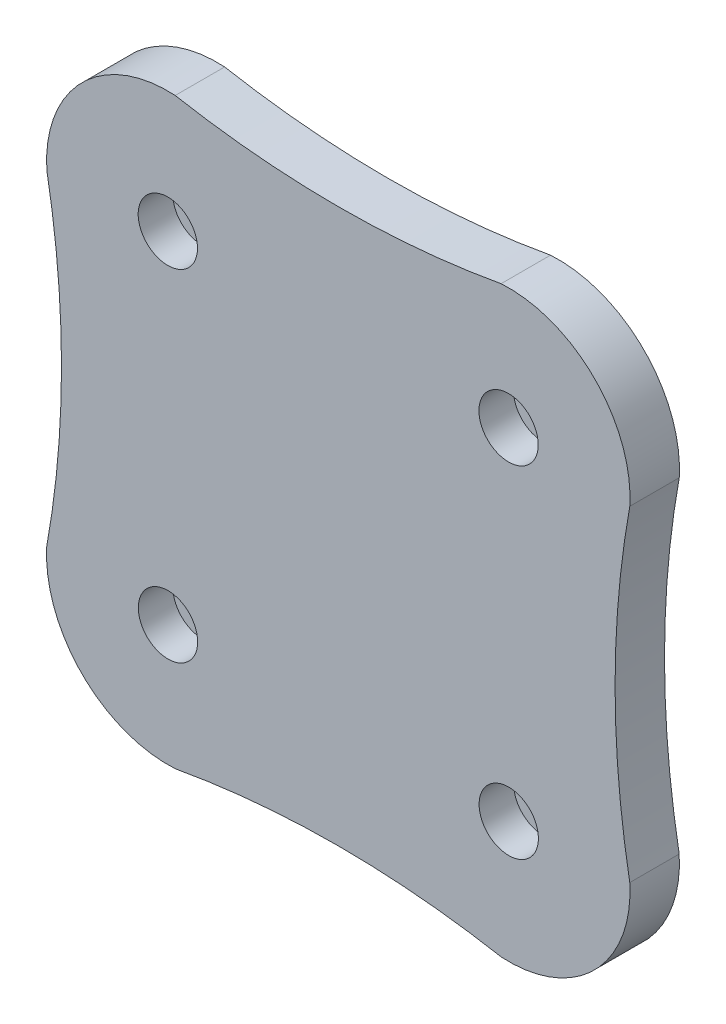
ISO-10303-21;
HEADER;
FILE_DESCRIPTION(('STEP AP214'),'2;1');
FILE_NAME('part.step','',(''),(''),'','','');
FILE_SCHEMA(('AUTOMOTIVE_DESIGN { 1 0 10303 214 1 1 1 1 }'));
ENDSEC;
DATA;
#1=APPLICATION_CONTEXT('core data for automotive mechanical design processes');
#2=APPLICATION_PROTOCOL_DEFINITION('international standard','automotive_design',2000,#1);
#3=PRODUCT_CONTEXT('',#1,'mechanical');
#4=PRODUCT('Part','Part','',(#3));
#5=PRODUCT_RELATED_PRODUCT_CATEGORY('part','',(#4));
#6=PRODUCT_DEFINITION_FORMATION('','',#4);
#7=PRODUCT_DEFINITION_CONTEXT('part definition',#1,'design');
#8=PRODUCT_DEFINITION('design','',#6,#7);
#9=PRODUCT_DEFINITION_SHAPE('','',#8);
#10=(LENGTH_UNIT() NAMED_UNIT(*) SI_UNIT(.MILLI.,.METRE.));
#11=(NAMED_UNIT(*) PLANE_ANGLE_UNIT() SI_UNIT($,.RADIAN.));
#12=(NAMED_UNIT(*) SI_UNIT($,.STERADIAN.) SOLID_ANGLE_UNIT());
#13=UNCERTAINTY_MEASURE_WITH_UNIT(LENGTH_MEASURE(1.E-05),#10,'distance_accuracy_value','');
#14=(GEOMETRIC_REPRESENTATION_CONTEXT(3) GLOBAL_UNCERTAINTY_ASSIGNED_CONTEXT((#13)) GLOBAL_UNIT_ASSIGNED_CONTEXT((#10,
#11,#12)) REPRESENTATION_CONTEXT('',''));
#15=CARTESIAN_POINT('',(0.,0.,0.));
#16=DIRECTION('',(0.,0.,1.));
#17=DIRECTION('',(1.,0.,0.));
#18=AXIS2_PLACEMENT_3D('',#15,#16,#17);
#19=CARTESIAN_POINT('',(57.2260711619407,-46.7757819921621,5.));
#20=DIRECTION('',(0.,0.,-1.));
#21=DIRECTION('',(-1.,0.,0.));
#22=AXIS2_PLACEMENT_3D('',#19,#20,#21);
#23=CYLINDRICAL_SURFACE('',#22,1.5);
#24=CARTESIAN_POINT('',(57.2260711619407,-46.7757819921621,0.));
#25=DIRECTION('',(0.,0.,1.));
#26=DIRECTION('',(1.,0.,0.));
#27=AXIS2_PLACEMENT_3D('',#24,#25,#26);
#28=CIRCLE('',#27,1.5);
#29=CARTESIAN_POINT('',(58.7260711619407,-46.7757819921621,0.));
#30=VERTEX_POINT('',#29);
#31=EDGE_CURVE('E158',#30,#30,#28,.T.);
#32=ORIENTED_EDGE('',*,*,#31,.F.);
#33=EDGE_LOOP('',(#32));
#34=FACE_BOUND('',#33,.T.);
#35=CARTESIAN_POINT('',(57.2260711619407,-46.7757819921621,1.5));
#36=DIRECTION('',(0.,0.,1.));
#37=DIRECTION('',(1.,0.,0.));
#38=AXIS2_PLACEMENT_3D('',#35,#36,#37);
#39=CIRCLE('',#38,1.5);
#40=CARTESIAN_POINT('',(58.7260711619407,-46.7757819921621,1.5));
#41=VERTEX_POINT('',#40);
#42=EDGE_CURVE('E39',#41,#41,#39,.T.);
#43=ORIENTED_EDGE('',*,*,#42,.T.);
#44=EDGE_LOOP('',(#43));
#45=FACE_BOUND('',#44,.T.);
#46=ADVANCED_FACE('F35',(#34,#45),#23,.F.);
#47=CARTESIAN_POINT('',(57.2442181625764,-81.24607131673,5.));
#48=DIRECTION('',(0.,0.,-1.));
#49=DIRECTION('',(-1.,0.,0.));
#50=AXIS2_PLACEMENT_3D('',#47,#48,#49);
#51=CYLINDRICAL_SURFACE('',#50,1.5);
#52=CARTESIAN_POINT('',(57.2442181625764,-81.24607131673,0.));
#53=DIRECTION('',(0.,0.,1.));
#54=DIRECTION('',(1.,0.,0.));
#55=AXIS2_PLACEMENT_3D('',#52,#53,#54);
#56=CIRCLE('',#55,1.5);
#57=CARTESIAN_POINT('',(58.7442181625764,-81.24607131673,0.));
#58=VERTEX_POINT('',#57);
#59=EDGE_CURVE('E155',#58,#58,#56,.T.);
#60=ORIENTED_EDGE('',*,*,#59,.F.);
#61=EDGE_LOOP('',(#60));
#62=FACE_BOUND('',#61,.T.);
#63=CARTESIAN_POINT('',(57.2442181625764,-81.24607131673,1.5));
#64=DIRECTION('',(0.,0.,1.));
#65=DIRECTION('',(1.,0.,0.));
#66=AXIS2_PLACEMENT_3D('',#63,#64,#65);
#67=CIRCLE('',#66,1.5);
#68=CARTESIAN_POINT('',(58.7442181625764,-81.24607131673,1.5));
#69=VERTEX_POINT('',#68);
#70=EDGE_CURVE('E178',#69,#69,#67,.T.);
#71=ORIENTED_EDGE('',*,*,#70,.T.);
#72=EDGE_LOOP('',(#71));
#73=FACE_BOUND('',#72,.T.);
#74=ADVANCED_FACE('F231',(#62,#73),#51,.F.);
#75=CARTESIAN_POINT('',(22.7739288380084,-81.2642183173656,5.));
#76=DIRECTION('',(0.,0.,-1.));
#77=DIRECTION('',(-1.,0.,0.));
#78=AXIS2_PLACEMENT_3D('',#75,#76,#77);
#79=CYLINDRICAL_SURFACE('',#78,1.5);
#80=CARTESIAN_POINT('',(22.7739288380084,-81.2642183173656,0.));
#81=DIRECTION('',(0.,0.,1.));
#82=DIRECTION('',(1.,0.,0.));
#83=AXIS2_PLACEMENT_3D('',#80,#81,#82);
#84=CIRCLE('',#83,1.5);
#85=CARTESIAN_POINT('',(24.2739288380084,-81.2642183173656,0.));
#86=VERTEX_POINT('',#85);
#87=EDGE_CURVE('E152',#86,#86,#84,.T.);
#88=ORIENTED_EDGE('',*,*,#87,.F.);
#89=EDGE_LOOP('',(#88));
#90=FACE_BOUND('',#89,.T.);
#91=CARTESIAN_POINT('',(22.7739288380084,-81.2642183173656,1.5));
#92=DIRECTION('',(0.,0.,1.));
#93=DIRECTION('',(1.,0.,0.));
#94=AXIS2_PLACEMENT_3D('',#91,#92,#93);
#95=CIRCLE('',#94,1.5);
#96=CARTESIAN_POINT('',(24.2739288380084,-81.2642183173656,1.5));
#97=VERTEX_POINT('',#96);
#98=EDGE_CURVE('E176',#97,#97,#95,.T.);
#99=ORIENTED_EDGE('',*,*,#98,.T.);
#100=EDGE_LOOP('',(#99));
#101=FACE_BOUND('',#100,.T.);
#102=ADVANCED_FACE('F237',(#90,#101),#79,.F.);
#103=CARTESIAN_POINT('',(22.7557818373727,-46.7939289927979,5.));
#104=DIRECTION('',(0.,0.,-1.));
#105=DIRECTION('',(-1.,0.,0.));
#106=AXIS2_PLACEMENT_3D('',#103,#104,#105);
#107=CYLINDRICAL_SURFACE('',#106,1.5);
#108=CARTESIAN_POINT('',(22.7557818373727,-46.7939289927979,0.));
#109=DIRECTION('',(0.,0.,1.));
#110=DIRECTION('',(1.,0.,0.));
#111=AXIS2_PLACEMENT_3D('',#108,#109,#110);
#112=CIRCLE('',#111,1.5);
#113=CARTESIAN_POINT('',(24.2557818373727,-46.7939289927979,0.));
#114=VERTEX_POINT('',#113);
#115=EDGE_CURVE('E161',#114,#114,#112,.T.);
#116=ORIENTED_EDGE('',*,*,#115,.F.);
#117=EDGE_LOOP('',(#116));
#118=FACE_BOUND('',#117,.T.);
#119=CARTESIAN_POINT('',(22.7557818373727,-46.7939289927979,1.5));
#120=DIRECTION('',(0.,0.,1.));
#121=DIRECTION('',(1.,0.,0.));
#122=AXIS2_PLACEMENT_3D('',#119,#120,#121);
#123=CIRCLE('',#122,1.5);
#124=CARTESIAN_POINT('',(24.2557818373727,-46.7939289927979,1.5));
#125=VERTEX_POINT('',#124);
#126=EDGE_CURVE('E135',#125,#125,#123,.T.);
#127=ORIENTED_EDGE('',*,*,#126,.T.);
#128=EDGE_LOOP('',(#127));
#129=FACE_BOUND('',#128,.T.);
#130=ADVANCED_FACE('F242',(#118,#129),#107,.F.);
#131=CARTESIAN_POINT('',(39.9999999999743,55.9799998452358,5.));
#132=DIRECTION('',(0.,0.,-1.));
#133=DIRECTION('',(-1.,0.,0.));
#134=AXIS2_PLACEMENT_3D('',#131,#132,#133);
#135=CYLINDRICAL_SURFACE('',#134,92.0000000000001);
#136=CARTESIAN_POINT('',(39.9999999999743,55.9799998452358,0.));
#137=DIRECTION('',(0.,0.,1.));
#138=DIRECTION('',(1.,0.,0.));
#139=AXIS2_PLACEMENT_3D('',#136,#137,#138);
#140=CIRCLE('',#139,92.0000000000001);
#141=CARTESIAN_POINT('',(23.5019244533808,-34.5286378821044,0.));
#142=VERTEX_POINT('',#141);
#143=CARTESIAN_POINT('',(56.4698938359388,-34.5337703614685,0.));
#144=VERTEX_POINT('',#143);
#145=EDGE_CURVE('E131',#142,#144,#140,.T.);
#146=ORIENTED_EDGE('',*,*,#145,.F.);
#147=DIRECTION('',(0.,0.,-1.));
#148=VECTOR('',#147,1.);
#149=CARTESIAN_POINT('',(23.5019244533808,-34.5286378821044,5.));
#150=LINE('',#149,#148);
#151=CARTESIAN_POINT('',(23.5019244533808,-34.5286378821044,5.));
#152=VERTEX_POINT('',#151);
#153=EDGE_CURVE('E11',#152,#142,#150,.T.);
#154=ORIENTED_EDGE('',*,*,#153,.F.);
#155=CARTESIAN_POINT('',(39.9999999999743,55.9799998452358,5.));
#156=DIRECTION('',(0.,0.,1.));
#157=DIRECTION('',(1.,0.,0.));
#158=AXIS2_PLACEMENT_3D('',#155,#156,#157);
#159=CIRCLE('',#158,92.0000000000001);
#160=CARTESIAN_POINT('',(56.4698938359388,-34.5337703614685,5.));
#161=VERTEX_POINT('',#160);
#162=EDGE_CURVE('E164',#152,#161,#159,.T.);
#163=ORIENTED_EDGE('',*,*,#162,.T.);
#164=DIRECTION('',(0.,0.,-1.));
#165=VECTOR('',#164,1.);
#166=CARTESIAN_POINT('',(56.4698938359388,-34.5337703614685,5.));
#167=LINE('',#166,#165);
#168=EDGE_CURVE('E88',#161,#144,#167,.T.);
#169=ORIENTED_EDGE('',*,*,#168,.T.);
#170=EDGE_LOOP('',(#146,#154,#163,#169));
#171=FACE_BOUND('',#170,.T.);
#172=ADVANCED_FACE('F37',(#171),#135,.F.);
#173=CARTESIAN_POINT('',(22.766459460917,-46.7832513692541,5.));
#174=DIRECTION('',(0.,0.,-1.));
#175=DIRECTION('',(-1.,0.,0.));
#176=AXIS2_PLACEMENT_3D('',#173,#174,#175);
#177=CYLINDRICAL_SURFACE('',#176,12.2766632467691);
#178=CARTESIAN_POINT('',(22.766459460917,-46.7832513692541,0.));
#179=DIRECTION('',(0.,0.,1.));
#180=DIRECTION('',(1.,0.,0.));
#181=AXIS2_PLACEMENT_3D('',#178,#179,#180);
#182=CIRCLE('',#181,12.2766632467691);
#183=CARTESIAN_POINT('',(10.5137702066786,-47.5501063187987,0.));
#184=VERTEX_POINT('',#183);
#185=EDGE_CURVE('E134',#142,#184,#182,.T.);
#186=ORIENTED_EDGE('',*,*,#185,.T.);
#187=DIRECTION('',(0.,0.,-1.));
#188=VECTOR('',#187,1.);
#189=CARTESIAN_POINT('',(10.5137702066786,-47.5501063187987,5.));
#190=LINE('',#189,#188);
#191=CARTESIAN_POINT('',(10.5137702066786,-47.5501063187987,5.));
#192=VERTEX_POINT('',#191);
#193=EDGE_CURVE('E45',#192,#184,#190,.T.);
#194=ORIENTED_EDGE('',*,*,#193,.F.);
#195=CARTESIAN_POINT('',(22.766459460917,-46.7832513692541,5.));
#196=DIRECTION('',(0.,0.,1.));
#197=DIRECTION('',(1.,0.,0.));
#198=AXIS2_PLACEMENT_3D('',#195,#196,#197);
#199=CIRCLE('',#198,12.2766632467691);
#200=EDGE_CURVE('E196',#152,#192,#199,.T.);
#201=ORIENTED_EDGE('',*,*,#200,.F.);
#202=ORIENTED_EDGE('',*,*,#153,.T.);
#203=EDGE_LOOP('',(#186,#194,#201,#202));
#204=FACE_BOUND('',#203,.T.);
#205=ADVANCED_FACE('F215',(#204),#177,.T.);
#206=CARTESIAN_POINT('',(-80.0000000000232,-64.0200001547639,5.));
#207=DIRECTION('',(0.,0.,-1.));
#208=DIRECTION('',(-1.,0.,0.));
#209=AXIS2_PLACEMENT_3D('',#206,#207,#208);
#210=CYLINDRICAL_SURFACE('',#209,91.9999999999977);
#211=CARTESIAN_POINT('',(-80.0000000000232,-64.0200001547639,0.));
#212=DIRECTION('',(0.,0.,1.));
#213=DIRECTION('',(1.,0.,0.));
#214=AXIS2_PLACEMENT_3D('',#211,#212,#213);
#215=CIRCLE('',#214,91.9999999999977);
#216=CARTESIAN_POINT('',(10.5086377273147,-80.518075701357,0.));
#217=VERTEX_POINT('',#216);
#218=EDGE_CURVE('E138',#217,#184,#215,.T.);
#219=ORIENTED_EDGE('',*,*,#218,.F.);
#220=DIRECTION('',(0.,0.,-1.));
#221=VECTOR('',#220,1.);
#222=CARTESIAN_POINT('',(10.5086377273147,-80.518075701357,5.));
#223=LINE('',#222,#221);
#224=CARTESIAN_POINT('',(10.5086377273147,-80.518075701357,5.));
#225=VERTEX_POINT('',#224);
#226=EDGE_CURVE('E170',#225,#217,#223,.T.);
#227=ORIENTED_EDGE('',*,*,#226,.F.);
#228=CARTESIAN_POINT('',(-80.0000000000232,-64.0200001547639,5.));
#229=DIRECTION('',(0.,0.,1.));
#230=DIRECTION('',(1.,0.,0.));
#231=AXIS2_PLACEMENT_3D('',#228,#229,#230);
#232=CIRCLE('',#231,91.9999999999977);
#233=EDGE_CURVE('E198',#225,#192,#232,.T.);
#234=ORIENTED_EDGE('',*,*,#233,.T.);
#235=ORIENTED_EDGE('',*,*,#193,.T.);
#236=EDGE_LOOP('',(#219,#227,#234,#235));
#237=FACE_BOUND('',#236,.T.);
#238=ADVANCED_FACE('F218',(#237),#210,.F.);
#239=CARTESIAN_POINT('',(22.7632512144644,-81.2535406938215,5.));
#240=DIRECTION('',(0.,0.,-1.));
#241=DIRECTION('',(-1.,0.,0.));
#242=AXIS2_PLACEMENT_3D('',#239,#240,#241);
#243=CYLINDRICAL_SURFACE('',#242,12.2766632467691);
#244=CARTESIAN_POINT('',(22.7632512144644,-81.2535406938215,0.));
#245=DIRECTION('',(0.,0.,1.));
#246=DIRECTION('',(1.,0.,0.));
#247=AXIS2_PLACEMENT_3D('',#244,#245,#246);
#248=CIRCLE('',#247,12.2766632467691);
#249=CARTESIAN_POINT('',(23.5301061640101,-93.5062299480599,0.));
#250=VERTEX_POINT('',#249);
#251=EDGE_CURVE('E141',#217,#250,#248,.T.);
#252=ORIENTED_EDGE('',*,*,#251,.T.);
#253=DIRECTION('',(0.,0.,-1.));
#254=VECTOR('',#253,1.);
#255=CARTESIAN_POINT('',(23.5301061640101,-93.5062299480599,5.));
#256=LINE('',#255,#254);
#257=CARTESIAN_POINT('',(23.5301061640101,-93.5062299480599,5.));
#258=VERTEX_POINT('',#257);
#259=EDGE_CURVE('E168',#258,#250,#256,.T.);
#260=ORIENTED_EDGE('',*,*,#259,.F.);
#261=CARTESIAN_POINT('',(22.7632512144644,-81.2535406938215,5.));
#262=DIRECTION('',(0.,0.,1.));
#263=DIRECTION('',(1.,0.,0.));
#264=AXIS2_PLACEMENT_3D('',#261,#262,#263);
#265=CIRCLE('',#264,12.2766632467691);
#266=EDGE_CURVE('E201',#225,#258,#265,.T.);
#267=ORIENTED_EDGE('',*,*,#266,.F.);
#268=ORIENTED_EDGE('',*,*,#226,.T.);
#269=EDGE_LOOP('',(#252,#260,#267,#268));
#270=FACE_BOUND('',#269,.T.);
#271=ADVANCED_FACE('F221',(#270),#243,.T.);
#272=CARTESIAN_POINT('',(39.9999999999744,-184.020000154764,5.));
#273=DIRECTION('',(0.,0.,-1.));
#274=DIRECTION('',(-1.,0.,0.));
#275=AXIS2_PLACEMENT_3D('',#272,#273,#274);
#276=CYLINDRICAL_SURFACE('',#275,92.);
#277=CARTESIAN_POINT('',(39.9999999999744,-184.020000154764,0.));
#278=DIRECTION('',(0.,0.,1.));
#279=DIRECTION('',(1.,0.,0.));
#280=AXIS2_PLACEMENT_3D('',#277,#278,#279);
#281=CIRCLE('',#280,92.);
#282=CARTESIAN_POINT('',(56.4980755465676,-93.511362427424,0.));
#283=VERTEX_POINT('',#282);
#284=EDGE_CURVE('E144',#283,#250,#281,.T.);
#285=ORIENTED_EDGE('',*,*,#284,.F.);
#286=DIRECTION('',(0.,0.,-1.));
#287=VECTOR('',#286,1.);
#288=CARTESIAN_POINT('',(56.4980755465676,-93.511362427424,5.));
#289=LINE('',#288,#287);
#290=CARTESIAN_POINT('',(56.4980755465676,-93.511362427424,5.));
#291=VERTEX_POINT('',#290);
#292=EDGE_CURVE('E124',#291,#283,#289,.T.);
#293=ORIENTED_EDGE('',*,*,#292,.F.);
#294=CARTESIAN_POINT('',(39.9999999999744,-184.020000154764,5.));
#295=DIRECTION('',(0.,0.,1.));
#296=DIRECTION('',(1.,0.,0.));
#297=AXIS2_PLACEMENT_3D('',#294,#295,#296);
#298=CIRCLE('',#297,92.);
#299=EDGE_CURVE('E113',#291,#258,#298,.T.);
#300=ORIENTED_EDGE('',*,*,#299,.T.);
#301=ORIENTED_EDGE('',*,*,#259,.T.);
#302=EDGE_LOOP('',(#285,#293,#300,#301));
#303=FACE_BOUND('',#302,.T.);
#304=ADVANCED_FACE('F204',(#303),#276,.F.);
#305=CARTESIAN_POINT('',(57.2335405390316,-81.2567489402743,5.));
#306=DIRECTION('',(0.,0.,-1.));
#307=DIRECTION('',(-1.,0.,0.));
#308=AXIS2_PLACEMENT_3D('',#305,#306,#307);
#309=CYLINDRICAL_SURFACE('',#308,12.2766632467691);
#310=CARTESIAN_POINT('',(57.2335405390316,-81.2567489402743,0.));
#311=DIRECTION('',(0.,0.,1.));
#312=DIRECTION('',(1.,0.,0.));
#313=AXIS2_PLACEMENT_3D('',#310,#311,#312);
#314=CIRCLE('',#313,12.2766632467691);
#315=CARTESIAN_POINT('',(69.48622979327,-80.48989399073,0.));
#316=VERTEX_POINT('',#315);
#317=EDGE_CURVE('E120',#283,#316,#314,.T.);
#318=ORIENTED_EDGE('',*,*,#317,.T.);
#319=DIRECTION('',(0.,0.,-1.));
#320=VECTOR('',#319,1.);
#321=CARTESIAN_POINT('',(69.48622979327,-80.48989399073,5.));
#322=LINE('',#321,#320);
#323=CARTESIAN_POINT('',(69.48622979327,-80.48989399073,5.));
#324=VERTEX_POINT('',#323);
#325=EDGE_CURVE('E117',#324,#316,#322,.T.);
#326=ORIENTED_EDGE('',*,*,#325,.F.);
#327=CARTESIAN_POINT('',(57.2335405390316,-81.2567489402743,5.));
#328=DIRECTION('',(0.,0.,1.));
#329=DIRECTION('',(1.,0.,0.));
#330=AXIS2_PLACEMENT_3D('',#327,#328,#329);
#331=CIRCLE('',#330,12.2766632467691);
#332=EDGE_CURVE('E107',#291,#324,#331,.T.);
#333=ORIENTED_EDGE('',*,*,#332,.F.);
#334=ORIENTED_EDGE('',*,*,#292,.T.);
#335=EDGE_LOOP('',(#318,#326,#333,#334));
#336=FACE_BOUND('',#335,.T.);
#337=ADVANCED_FACE('F118',(#336),#309,.T.);
#338=CARTESIAN_POINT('',(159.999999999929,-64.0200001547655,5.));
#339=DIRECTION('',(0.,0.,-1.));
#340=DIRECTION('',(-1.,0.,0.));
#341=AXIS2_PLACEMENT_3D('',#338,#339,#340);
#342=CYLINDRICAL_SURFACE('',#341,91.9999999999559);
#343=CARTESIAN_POINT('',(159.999999999929,-64.0200001547655,0.));
#344=DIRECTION('',(0.,0.,1.));
#345=DIRECTION('',(1.,0.,0.));
#346=AXIS2_PLACEMENT_3D('',#343,#344,#345);
#347=CIRCLE('',#346,91.9999999999559);
#348=CARTESIAN_POINT('',(69.4913622726341,-47.5219246081724,0.));
#349=VERTEX_POINT('',#348);
#350=EDGE_CURVE('E148',#349,#316,#347,.T.);
#351=ORIENTED_EDGE('',*,*,#350,.F.);
#352=DIRECTION('',(0.,0.,-1.));
#353=VECTOR('',#352,1.);
#354=CARTESIAN_POINT('',(69.4913622726341,-47.5219246081724,5.));
#355=LINE('',#354,#353);
#356=CARTESIAN_POINT('',(69.4913622726341,-47.5219246081724,5.));
#357=VERTEX_POINT('',#356);
#358=EDGE_CURVE('E81',#357,#349,#355,.T.);
#359=ORIENTED_EDGE('',*,*,#358,.F.);
#360=CARTESIAN_POINT('',(159.999999999929,-64.0200001547655,5.));
#361=DIRECTION('',(0.,0.,1.));
#362=DIRECTION('',(1.,0.,0.));
#363=AXIS2_PLACEMENT_3D('',#360,#361,#362);
#364=CIRCLE('',#363,91.9999999999559);
#365=EDGE_CURVE('E111',#357,#324,#364,.T.);
#366=ORIENTED_EDGE('',*,*,#365,.T.);
#367=ORIENTED_EDGE('',*,*,#325,.T.);
#368=EDGE_LOOP('',(#351,#359,#366,#367));
#369=FACE_BOUND('',#368,.T.);
#370=ADVANCED_FACE('F126',(#369),#342,.F.);
#371=CARTESIAN_POINT('',(57.2367487854845,-46.7864596157069,5.));
#372=DIRECTION('',(0.,0.,-1.));
#373=DIRECTION('',(-1.,0.,0.));
#374=AXIS2_PLACEMENT_3D('',#371,#372,#373);
#375=CYLINDRICAL_SURFACE('',#374,12.2766632467691);
#376=CARTESIAN_POINT('',(57.2367487854845,-46.7864596157069,0.));
#377=DIRECTION('',(0.,0.,1.));
#378=DIRECTION('',(1.,0.,0.));
#379=AXIS2_PLACEMENT_3D('',#376,#377,#378);
#380=CIRCLE('',#379,12.2766632467691);
#381=EDGE_CURVE('E150',#349,#144,#380,.T.);
#382=ORIENTED_EDGE('',*,*,#381,.T.);
#383=ORIENTED_EDGE('',*,*,#168,.F.);
#384=CARTESIAN_POINT('',(57.2367487854845,-46.7864596157069,5.));
#385=DIRECTION('',(0.,0.,1.));
#386=DIRECTION('',(1.,0.,0.));
#387=AXIS2_PLACEMENT_3D('',#384,#385,#386);
#388=CIRCLE('',#387,12.2766632467691);
#389=EDGE_CURVE('E54',#357,#161,#388,.T.);
#390=ORIENTED_EDGE('',*,*,#389,.F.);
#391=ORIENTED_EDGE('',*,*,#358,.T.);
#392=EDGE_LOOP('',(#382,#383,#390,#391));
#393=FACE_BOUND('',#392,.T.);
#394=ADVANCED_FACE('F211',(#393),#375,.T.);
#395=CARTESIAN_POINT('',(0.,0.,5.));
#396=DIRECTION('',(0.,0.,1.));
#397=DIRECTION('',(1.,0.,0.));
#398=AXIS2_PLACEMENT_3D('',#395,#396,#397);
#399=PLANE('',#398);
#400=CARTESIAN_POINT('',(57.2260711619407,-46.7757819921617,5.));
#401=DIRECTION('',(0.,0.,1.));
#402=DIRECTION('',(1.,0.,0.));
#403=AXIS2_PLACEMENT_3D('',#400,#401,#402);
#404=CIRCLE('',#403,3.);
#405=CARTESIAN_POINT('',(60.2260711619407,-46.7757819921617,5.));
#406=VERTEX_POINT('',#405);
#407=EDGE_CURVE('E454',#406,#406,#404,.T.);
#408=ORIENTED_EDGE('',*,*,#407,.F.);
#409=EDGE_LOOP('',(#408));
#410=FACE_BOUND('',#409,.T.);
#411=CARTESIAN_POINT('',(57.2442181625767,-81.2460713167296,5.));
#412=DIRECTION('',(0.,0.,1.));
#413=DIRECTION('',(1.,0.,0.));
#414=AXIS2_PLACEMENT_3D('',#411,#412,#413);
#415=CIRCLE('',#414,2.99999999999999);
#416=CARTESIAN_POINT('',(60.2442181625767,-81.2460713167296,5.));
#417=VERTEX_POINT('',#416);
#418=EDGE_CURVE('E462',#417,#417,#415,.T.);
#419=ORIENTED_EDGE('',*,*,#418,.F.);
#420=EDGE_LOOP('',(#419));
#421=FACE_BOUND('',#420,.T.);
#422=CARTESIAN_POINT('',(22.7739288380088,-81.2642183173656,5.));
#423=DIRECTION('',(0.,0.,1.));
#424=DIRECTION('',(1.,0.,0.));
#425=AXIS2_PLACEMENT_3D('',#422,#423,#424);
#426=CIRCLE('',#425,3.);
#427=CARTESIAN_POINT('',(25.7739288380088,-81.2642183173656,5.));
#428=VERTEX_POINT('',#427);
#429=EDGE_CURVE('E467',#428,#428,#426,.T.);
#430=ORIENTED_EDGE('',*,*,#429,.F.);
#431=EDGE_LOOP('',(#430));
#432=FACE_BOUND('',#431,.T.);
#433=CARTESIAN_POINT('',(22.7557818373727,-46.7939289927979,5.));
#434=DIRECTION('',(0.,0.,1.));
#435=DIRECTION('',(1.,0.,0.));
#436=AXIS2_PLACEMENT_3D('',#433,#434,#435);
#437=CIRCLE('',#436,3.);
#438=CARTESIAN_POINT('',(25.7557818373727,-46.7939289927979,5.));
#439=VERTEX_POINT('',#438);
#440=EDGE_CURVE('E184',#439,#439,#437,.T.);
#441=ORIENTED_EDGE('',*,*,#440,.F.);
#442=EDGE_LOOP('',(#441));
#443=FACE_BOUND('',#442,.T.);
#444=ORIENTED_EDGE('',*,*,#162,.F.);
#445=ORIENTED_EDGE('',*,*,#200,.T.);
#446=ORIENTED_EDGE('',*,*,#233,.F.);
#447=ORIENTED_EDGE('',*,*,#266,.T.);
#448=ORIENTED_EDGE('',*,*,#299,.F.);
#449=ORIENTED_EDGE('',*,*,#332,.T.);
#450=ORIENTED_EDGE('',*,*,#365,.F.);
#451=ORIENTED_EDGE('',*,*,#389,.T.);
#452=EDGE_LOOP('',(#444,#445,#446,#447,#448,#449,#450,#451));
#453=FACE_BOUND('',#452,.T.);
#454=ADVANCED_FACE('F109',(#410,#421,#432,#443,#453),#399,.T.);
#455=CARTESIAN_POINT('',(0.,0.,0.));
#456=DIRECTION('',(0.,0.,1.));
#457=DIRECTION('',(1.,0.,0.));
#458=AXIS2_PLACEMENT_3D('',#455,#456,#457);
#459=PLANE('',#458);
#460=ORIENTED_EDGE('',*,*,#145,.T.);
#461=ORIENTED_EDGE('',*,*,#381,.F.);
#462=ORIENTED_EDGE('',*,*,#350,.T.);
#463=ORIENTED_EDGE('',*,*,#317,.F.);
#464=ORIENTED_EDGE('',*,*,#284,.T.);
#465=ORIENTED_EDGE('',*,*,#251,.F.);
#466=ORIENTED_EDGE('',*,*,#218,.T.);
#467=ORIENTED_EDGE('',*,*,#185,.F.);
#468=EDGE_LOOP('',(#460,#461,#462,#463,#464,#465,#466,#467));
#469=FACE_BOUND('',#468,.T.);
#470=ORIENTED_EDGE('',*,*,#87,.T.);
#471=EDGE_LOOP('',(#470));
#472=FACE_BOUND('',#471,.T.);
#473=ORIENTED_EDGE('',*,*,#59,.T.);
#474=EDGE_LOOP('',(#473));
#475=FACE_BOUND('',#474,.T.);
#476=ORIENTED_EDGE('',*,*,#31,.T.);
#477=EDGE_LOOP('',(#476));
#478=FACE_BOUND('',#477,.T.);
#479=ORIENTED_EDGE('',*,*,#115,.T.);
#480=EDGE_LOOP('',(#479));
#481=FACE_BOUND('',#480,.T.);
#482=ADVANCED_FACE('F207',(#469,#472,#475,#478,#481),#459,.F.);
#483=CARTESIAN_POINT('',(22.7557818373727,-46.7939289927979,1.5));
#484=DIRECTION('',(0.,0.,1.));
#485=DIRECTION('',(1.,0.,0.));
#486=AXIS2_PLACEMENT_3D('',#483,#484,#485);
#487=CYLINDRICAL_SURFACE('',#486,3.);
#488=CARTESIAN_POINT('',(22.7557818373727,-46.7939289927979,1.5));
#489=DIRECTION('',(0.,0.,1.));
#490=DIRECTION('',(1.,0.,0.));
#491=AXIS2_PLACEMENT_3D('',#488,#489,#490);
#492=CIRCLE('',#491,3.);
#493=CARTESIAN_POINT('',(25.7557818373727,-46.7939289927979,1.5));
#494=VERTEX_POINT('',#493);
#495=EDGE_CURVE('E175',#494,#494,#492,.T.);
#496=ORIENTED_EDGE('',*,*,#495,.F.);
#497=EDGE_LOOP('',(#496));
#498=FACE_BOUND('',#497,.T.);
#499=ORIENTED_EDGE('',*,*,#440,.T.);
#500=EDGE_LOOP('',(#499));
#501=FACE_BOUND('',#500,.T.);
#502=ADVANCED_FACE('F280',(#498,#501),#487,.F.);
#503=CARTESIAN_POINT('',(22.7557818373727,-46.7939289927979,1.5));
#504=DIRECTION('',(0.,0.,1.));
#505=DIRECTION('',(1.,0.,0.));
#506=AXIS2_PLACEMENT_3D('',#503,#504,#505);
#507=PLANE('',#506);
#508=ORIENTED_EDGE('',*,*,#126,.F.);
#509=EDGE_LOOP('',(#508));
#510=FACE_BOUND('',#509,.T.);
#511=ORIENTED_EDGE('',*,*,#495,.T.);
#512=EDGE_LOOP('',(#511));
#513=FACE_BOUND('',#512,.T.);
#514=ADVANCED_FACE('F285',(#510,#513),#507,.T.);
#515=CARTESIAN_POINT('',(22.7739288380088,-81.2642183173656,1.5));
#516=DIRECTION('',(0.,0.,1.));
#517=DIRECTION('',(1.,0.,0.));
#518=AXIS2_PLACEMENT_3D('',#515,#516,#517);
#519=CYLINDRICAL_SURFACE('',#518,3.);
#520=CARTESIAN_POINT('',(22.7739288380088,-81.2642183173656,1.5));
#521=DIRECTION('',(0.,0.,1.));
#522=DIRECTION('',(1.,0.,0.));
#523=AXIS2_PLACEMENT_3D('',#520,#521,#522);
#524=CIRCLE('',#523,3.);
#525=CARTESIAN_POINT('',(25.7739288380088,-81.2642183173656,1.5));
#526=VERTEX_POINT('',#525);
#527=EDGE_CURVE('E465',#526,#526,#524,.T.);
#528=ORIENTED_EDGE('',*,*,#527,.F.);
#529=EDGE_LOOP('',(#528));
#530=FACE_BOUND('',#529,.T.);
#531=ORIENTED_EDGE('',*,*,#429,.T.);
#532=EDGE_LOOP('',(#531));
#533=FACE_BOUND('',#532,.T.);
#534=ADVANCED_FACE('F293',(#530,#533),#519,.F.);
#535=CARTESIAN_POINT('',(22.7739288380088,-81.2642183173656,1.5));
#536=DIRECTION('',(0.,0.,1.));
#537=DIRECTION('',(1.,0.,0.));
#538=AXIS2_PLACEMENT_3D('',#535,#536,#537);
#539=PLANE('',#538);
#540=ORIENTED_EDGE('',*,*,#98,.F.);
#541=EDGE_LOOP('',(#540));
#542=FACE_BOUND('',#541,.T.);
#543=ORIENTED_EDGE('',*,*,#527,.T.);
#544=EDGE_LOOP('',(#543));
#545=FACE_BOUND('',#544,.T.);
#546=ADVANCED_FACE('F301',(#542,#545),#539,.T.);
#547=CARTESIAN_POINT('',(57.2442181625767,-81.2460713167296,1.5));
#548=DIRECTION('',(0.,0.,1.));
#549=DIRECTION('',(1.,0.,0.));
#550=AXIS2_PLACEMENT_3D('',#547,#548,#549);
#551=CYLINDRICAL_SURFACE('',#550,2.99999999999999);
#552=CARTESIAN_POINT('',(57.2442181625767,-81.2460713167296,1.5));
#553=DIRECTION('',(0.,0.,1.));
#554=DIRECTION('',(1.,0.,0.));
#555=AXIS2_PLACEMENT_3D('',#552,#553,#554);
#556=CIRCLE('',#555,2.99999999999999);
#557=CARTESIAN_POINT('',(60.2442181625767,-81.2460713167296,1.5));
#558=VERTEX_POINT('',#557);
#559=EDGE_CURVE('E457',#558,#558,#556,.T.);
#560=ORIENTED_EDGE('',*,*,#559,.F.);
#561=EDGE_LOOP('',(#560));
#562=FACE_BOUND('',#561,.T.);
#563=ORIENTED_EDGE('',*,*,#418,.T.);
#564=EDGE_LOOP('',(#563));
#565=FACE_BOUND('',#564,.T.);
#566=ADVANCED_FACE('F309',(#562,#565),#551,.F.);
#567=CARTESIAN_POINT('',(57.2442181625767,-81.2460713167296,1.5));
#568=DIRECTION('',(0.,0.,1.));
#569=DIRECTION('',(1.,0.,0.));
#570=AXIS2_PLACEMENT_3D('',#567,#568,#569);
#571=PLANE('',#570);
#572=ORIENTED_EDGE('',*,*,#70,.F.);
#573=EDGE_LOOP('',(#572));
#574=FACE_BOUND('',#573,.T.);
#575=ORIENTED_EDGE('',*,*,#559,.T.);
#576=EDGE_LOOP('',(#575));
#577=FACE_BOUND('',#576,.T.);
#578=ADVANCED_FACE('F317',(#574,#577),#571,.T.);
#579=CARTESIAN_POINT('',(57.2260711619407,-46.7757819921617,1.5));
#580=DIRECTION('',(0.,0.,1.));
#581=DIRECTION('',(1.,0.,0.));
#582=AXIS2_PLACEMENT_3D('',#579,#580,#581);
#583=CYLINDRICAL_SURFACE('',#582,3.);
#584=CARTESIAN_POINT('',(57.2260711619407,-46.7757819921617,1.5));
#585=DIRECTION('',(0.,0.,1.));
#586=DIRECTION('',(1.,0.,0.));
#587=AXIS2_PLACEMENT_3D('',#584,#585,#586);
#588=CIRCLE('',#587,3.);
#589=CARTESIAN_POINT('',(60.2260711619407,-46.7757819921617,1.5));
#590=VERTEX_POINT('',#589);
#591=EDGE_CURVE('E179',#590,#590,#588,.T.);
#592=ORIENTED_EDGE('',*,*,#591,.F.);
#593=EDGE_LOOP('',(#592));
#594=FACE_BOUND('',#593,.T.);
#595=ORIENTED_EDGE('',*,*,#407,.T.);
#596=EDGE_LOOP('',(#595));
#597=FACE_BOUND('',#596,.T.);
#598=ADVANCED_FACE('F325',(#594,#597),#583,.F.);
#599=CARTESIAN_POINT('',(57.2260711619407,-46.7757819921617,1.5));
#600=DIRECTION('',(0.,0.,1.));
#601=DIRECTION('',(1.,0.,0.));
#602=AXIS2_PLACEMENT_3D('',#599,#600,#601);
#603=PLANE('',#602);
#604=ORIENTED_EDGE('',*,*,#42,.F.);
#605=EDGE_LOOP('',(#604));
#606=FACE_BOUND('',#605,.T.);
#607=ORIENTED_EDGE('',*,*,#591,.T.);
#608=EDGE_LOOP('',(#607));
#609=FACE_BOUND('',#608,.T.);
#610=ADVANCED_FACE('F333',(#606,#609),#603,.T.);
#611=CLOSED_SHELL('',(#46,#74,#102,#130,#172,#205,#238,#271,#304,#337,#370,#394,#454,#482,#502,
#514,#534,#546,#566,#578,#598,#610));
#612=MANIFOLD_SOLID_BREP('B2',#611);
#613=ADVANCED_BREP_SHAPE_REPRESENTATION('',(#18,#612),#14);
#614=SHAPE_DEFINITION_REPRESENTATION(#9,#613);
ENDSEC;
END-ISO-10303-21;
